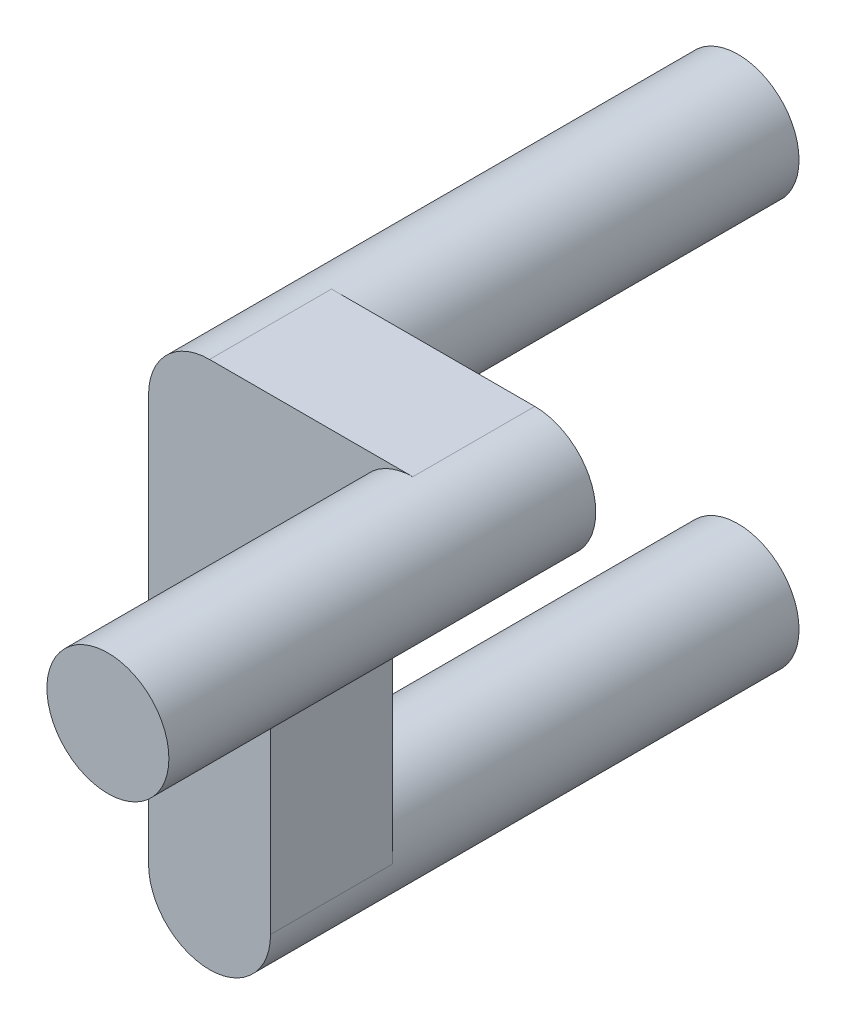
ISO-10303-21;
HEADER;
FILE_DESCRIPTION(('STEP AP214'),'2;1');
FILE_NAME('part.step','',(''),(''),'','','');
FILE_SCHEMA(('AUTOMOTIVE_DESIGN { 1 0 10303 214 1 1 1 1 }'));
ENDSEC;
DATA;
#1=APPLICATION_CONTEXT('core data for automotive mechanical design processes');
#2=APPLICATION_PROTOCOL_DEFINITION('international standard','automotive_design',2000,#1);
#3=PRODUCT_CONTEXT('',#1,'mechanical');
#4=PRODUCT('Part','Part','',(#3));
#5=PRODUCT_RELATED_PRODUCT_CATEGORY('part','',(#4));
#6=PRODUCT_DEFINITION_FORMATION('','',#4);
#7=PRODUCT_DEFINITION_CONTEXT('part definition',#1,'design');
#8=PRODUCT_DEFINITION('design','',#6,#7);
#9=PRODUCT_DEFINITION_SHAPE('','',#8);
#10=(LENGTH_UNIT() NAMED_UNIT(*) SI_UNIT(.MILLI.,.METRE.));
#11=(NAMED_UNIT(*) PLANE_ANGLE_UNIT() SI_UNIT($,.RADIAN.));
#12=(NAMED_UNIT(*) SI_UNIT($,.STERADIAN.) SOLID_ANGLE_UNIT());
#13=UNCERTAINTY_MEASURE_WITH_UNIT(LENGTH_MEASURE(1.E-05),#10,'distance_accuracy_value','');
#14=(GEOMETRIC_REPRESENTATION_CONTEXT(3) GLOBAL_UNCERTAINTY_ASSIGNED_CONTEXT((#13)) GLOBAL_UNIT_ASSIGNED_CONTEXT((#10,
#11,#12)) REPRESENTATION_CONTEXT('',''));
#15=CARTESIAN_POINT('',(0.,0.,0.));
#16=DIRECTION('',(0.,0.,1.));
#17=DIRECTION('',(1.,0.,0.));
#18=AXIS2_PLACEMENT_3D('',#15,#16,#17);
#19=CARTESIAN_POINT('',(7.62,7.62,66.04));
#20=DIRECTION('',(0.,0.,1.));
#21=DIRECTION('',(1.,0.,0.));
#22=AXIS2_PLACEMENT_3D('',#19,#20,#21);
#23=PLANE('',#22);
#24=CARTESIAN_POINT('',(0.,-50.8,66.04));
#25=DIRECTION('',(0.,0.,1.));
#26=DIRECTION('',(1.,0.,0.));
#27=AXIS2_PLACEMENT_3D('',#24,#25,#26);
#28=CIRCLE('',#27,7.62);
#29=CARTESIAN_POINT('',(-7.62,-50.8,66.04));
#30=VERTEX_POINT('',#29);
#31=CARTESIAN_POINT('',(7.62,-50.8,66.04));
#32=VERTEX_POINT('',#31);
#33=EDGE_CURVE('E119',#30,#32,#28,.T.);
#34=ORIENTED_EDGE('',*,*,#33,.T.);
#35=DIRECTION('',(0.,-1.,0.));
#36=VECTOR('',#35,1.);
#37=CARTESIAN_POINT('',(7.62,7.62,66.04));
#38=LINE('',#37,#36);
#39=CARTESIAN_POINT('',(7.62,-7.62,66.04));
#40=VERTEX_POINT('',#39);
#41=EDGE_CURVE('E122',#40,#32,#38,.T.);
#42=ORIENTED_EDGE('',*,*,#41,.F.);
#43=DIRECTION('',(1.,0.,0.));
#44=VECTOR('',#43,1.);
#45=CARTESIAN_POINT('',(-7.62,-7.62,66.04));
#46=LINE('',#45,#44);
#47=CARTESIAN_POINT('',(25.4,-7.62,66.04));
#48=VERTEX_POINT('',#47);
#49=EDGE_CURVE('E83',#40,#48,#46,.T.);
#50=ORIENTED_EDGE('',*,*,#49,.T.);
#51=CARTESIAN_POINT('',(25.4,0.,66.04));
#52=DIRECTION('',(0.,0.,1.));
#53=DIRECTION('',(1.,0.,0.));
#54=AXIS2_PLACEMENT_3D('',#51,#52,#53);
#55=CIRCLE('',#54,7.62);
#56=CARTESIAN_POINT('',(25.4,7.62,66.04));
#57=VERTEX_POINT('',#56);
#58=EDGE_CURVE('E161',#57,#48,#55,.T.);
#59=ORIENTED_EDGE('',*,*,#58,.F.);
#60=DIRECTION('',(-1.,0.,0.));
#61=VECTOR('',#60,1.);
#62=CARTESIAN_POINT('',(7.62,7.62,66.04));
#63=LINE('',#62,#61);
#64=CARTESIAN_POINT('',(0.,7.62,66.04));
#65=VERTEX_POINT('',#64);
#66=EDGE_CURVE('E147',#57,#65,#63,.T.);
#67=ORIENTED_EDGE('',*,*,#66,.T.);
#68=CARTESIAN_POINT('',(0.,0.,66.04));
#69=DIRECTION('',(0.,0.,1.));
#70=DIRECTION('',(1.,0.,0.));
#71=AXIS2_PLACEMENT_3D('',#68,#69,#70);
#72=CIRCLE('',#71,7.62);
#73=CARTESIAN_POINT('',(-7.62,0.,66.04));
#74=VERTEX_POINT('',#73);
#75=EDGE_CURVE('E75',#65,#74,#72,.T.);
#76=ORIENTED_EDGE('',*,*,#75,.T.);
#77=DIRECTION('',(0.,-1.,0.));
#78=VECTOR('',#77,1.);
#79=CARTESIAN_POINT('',(-7.62,7.62,66.04));
#80=LINE('',#79,#78);
#81=EDGE_CURVE('E124',#74,#30,#80,.T.);
#82=ORIENTED_EDGE('',*,*,#81,.T.);
#83=EDGE_LOOP('',(#34,#42,#50,#59,#67,#76,#82));
#84=FACE_BOUND('',#83,.T.);
#85=ADVANCED_FACE('F59',(#84),#23,.T.);
#86=CARTESIAN_POINT('',(7.62,7.62,50.8));
#87=DIRECTION('',(1.,0.,0.));
#88=DIRECTION('',(0.,0.,-1.));
#89=AXIS2_PLACEMENT_3D('',#86,#87,#88);
#90=PLANE('',#89);
#91=ORIENTED_EDGE('',*,*,#41,.T.);
#92=DIRECTION('',(0.,0.,-1.));
#93=VECTOR('',#92,1.);
#94=CARTESIAN_POINT('',(7.62,-50.8,92.456));
#95=LINE('',#94,#93);
#96=CARTESIAN_POINT('',(7.62,-50.8,50.8));
#97=VERTEX_POINT('',#96);
#98=EDGE_CURVE('E131',#32,#97,#95,.T.);
#99=ORIENTED_EDGE('',*,*,#98,.T.);
#100=DIRECTION('',(0.,-1.,0.));
#101=VECTOR('',#100,1.);
#102=CARTESIAN_POINT('',(7.62,7.62,50.8));
#103=LINE('',#102,#101);
#104=CARTESIAN_POINT('',(7.62,-7.62,50.8));
#105=VERTEX_POINT('',#104);
#106=EDGE_CURVE('E153',#105,#97,#103,.T.);
#107=ORIENTED_EDGE('',*,*,#106,.F.);
#108=DIRECTION('',(0.,0.,1.));
#109=VECTOR('',#108,1.);
#110=CARTESIAN_POINT('',(7.62,-7.62,50.8));
#111=LINE('',#110,#109);
#112=EDGE_CURVE('E139',#105,#40,#111,.T.);
#113=ORIENTED_EDGE('',*,*,#112,.T.);
#114=EDGE_LOOP('',(#91,#99,#107,#113));
#115=FACE_BOUND('',#114,.T.);
#116=ADVANCED_FACE('F138',(#115),#90,.T.);
#117=CARTESIAN_POINT('',(-7.62,7.62,50.8));
#118=DIRECTION('',(-1.,0.,0.));
#119=DIRECTION('',(0.,0.,1.));
#120=AXIS2_PLACEMENT_3D('',#117,#118,#119);
#121=PLANE('',#120);
#122=ORIENTED_EDGE('',*,*,#81,.F.);
#123=DIRECTION('',(0.,0.,-1.));
#124=VECTOR('',#123,1.);
#125=CARTESIAN_POINT('',(-7.62,0.,92.456));
#126=LINE('',#125,#124);
#127=CARTESIAN_POINT('',(-7.62,0.,50.8));
#128=VERTEX_POINT('',#127);
#129=EDGE_CURVE('E197',#74,#128,#126,.T.);
#130=ORIENTED_EDGE('',*,*,#129,.T.);
#131=DIRECTION('',(0.,-1.,0.));
#132=VECTOR('',#131,1.);
#133=CARTESIAN_POINT('',(-7.62,7.62,50.8));
#134=LINE('',#133,#132);
#135=CARTESIAN_POINT('',(-7.62,-50.8,50.8));
#136=VERTEX_POINT('',#135);
#137=EDGE_CURVE('E145',#128,#136,#134,.T.);
#138=ORIENTED_EDGE('',*,*,#137,.T.);
#139=DIRECTION('',(0.,0.,-1.));
#140=VECTOR('',#139,1.);
#141=CARTESIAN_POINT('',(-7.62,-50.8,92.456));
#142=LINE('',#141,#140);
#143=EDGE_CURVE('E136',#30,#136,#142,.T.);
#144=ORIENTED_EDGE('',*,*,#143,.F.);
#145=EDGE_LOOP('',(#122,#130,#138,#144));
#146=FACE_BOUND('',#145,.T.);
#147=ADVANCED_FACE('F235',(#146),#121,.T.);
#148=CARTESIAN_POINT('',(0.,7.62,0.));
#149=DIRECTION('',(0.,-1.,0.));
#150=DIRECTION('',(0.,0.,-1.));
#151=AXIS2_PLACEMENT_3D('',#148,#149,#150);
#152=PLANE('',#151);
#153=DIRECTION('',(0.,0.,-1.));
#154=VECTOR('',#153,1.);
#155=CARTESIAN_POINT('',(0.,7.62,92.456));
#156=LINE('',#155,#154);
#157=CARTESIAN_POINT('',(0.,7.62,50.8));
#158=VERTEX_POINT('',#157);
#159=EDGE_CURVE('E194',#65,#158,#156,.T.);
#160=ORIENTED_EDGE('',*,*,#159,.F.);
#161=ORIENTED_EDGE('',*,*,#66,.F.);
#162=DIRECTION('',(0.,0.,1.));
#163=VECTOR('',#162,1.);
#164=CARTESIAN_POINT('',(25.4,7.62,18.034));
#165=LINE('',#164,#163);
#166=CARTESIAN_POINT('',(25.4,7.62,50.8));
#167=VERTEX_POINT('',#166);
#168=EDGE_CURVE('E186',#167,#57,#165,.T.);
#169=ORIENTED_EDGE('',*,*,#168,.F.);
#170=DIRECTION('',(1.,0.,0.));
#171=VECTOR('',#170,1.);
#172=CARTESIAN_POINT('',(7.62,7.62,50.8));
#173=LINE('',#172,#171);
#174=EDGE_CURVE('E141',#158,#167,#173,.T.);
#175=ORIENTED_EDGE('',*,*,#174,.F.);
#176=EDGE_LOOP('',(#160,#161,#169,#175));
#177=FACE_BOUND('',#176,.T.);
#178=ADVANCED_FACE('F210',(#177),#152,.F.);
#179=CARTESIAN_POINT('',(7.62,7.62,50.8));
#180=DIRECTION('',(0.,0.,-1.));
#181=DIRECTION('',(-1.,0.,0.));
#182=AXIS2_PLACEMENT_3D('',#179,#180,#181);
#183=PLANE('',#182);
#184=ORIENTED_EDGE('',*,*,#137,.F.);
#185=CARTESIAN_POINT('',(0.,0.,50.8));
#186=DIRECTION('',(0.,0.,1.));
#187=DIRECTION('',(1.,0.,0.));
#188=AXIS2_PLACEMENT_3D('',#185,#186,#187);
#189=CIRCLE('',#188,7.62);
#190=EDGE_CURVE('E166',#128,#158,#189,.T.);
#191=ORIENTED_EDGE('',*,*,#190,.T.);
#192=ORIENTED_EDGE('',*,*,#174,.T.);
#193=CARTESIAN_POINT('',(25.4,0.,50.8));
#194=DIRECTION('',(0.,0.,-1.));
#195=DIRECTION('',(-1.,0.,0.));
#196=AXIS2_PLACEMENT_3D('',#193,#194,#195);
#197=CIRCLE('',#196,7.62);
#198=CARTESIAN_POINT('',(25.4,-7.62,50.8));
#199=VERTEX_POINT('',#198);
#200=EDGE_CURVE('E182',#167,#199,#197,.T.);
#201=ORIENTED_EDGE('',*,*,#200,.T.);
#202=DIRECTION('',(1.,0.,0.));
#203=VECTOR('',#202,1.);
#204=CARTESIAN_POINT('',(-7.62,-7.62,50.8));
#205=LINE('',#204,#203);
#206=EDGE_CURVE('E170',#105,#199,#205,.T.);
#207=ORIENTED_EDGE('',*,*,#206,.F.);
#208=ORIENTED_EDGE('',*,*,#106,.T.);
#209=CARTESIAN_POINT('',(0.,-50.8,50.8));
#210=DIRECTION('',(0.,0.,1.));
#211=DIRECTION('',(1.,0.,0.));
#212=AXIS2_PLACEMENT_3D('',#209,#210,#211);
#213=CIRCLE('',#212,7.62);
#214=EDGE_CURVE('E12',#97,#136,#213,.T.);
#215=ORIENTED_EDGE('',*,*,#214,.T.);
#216=EDGE_LOOP('',(#184,#191,#192,#201,#207,#208,#215));
#217=FACE_BOUND('',#216,.T.);
#218=ADVANCED_FACE('F207',(#217),#183,.T.);
#219=CARTESIAN_POINT('',(0.,-50.8,50.8));
#220=DIRECTION('',(0.,0.,-1.));
#221=DIRECTION('',(-1.,0.,0.));
#222=AXIS2_PLACEMENT_3D('',#219,#220,#221);
#223=CYLINDRICAL_SURFACE('',#222,7.62);
#224=CARTESIAN_POINT('',(0.,-50.8,0.));
#225=DIRECTION('',(0.,0.,1.));
#226=DIRECTION('',(1.,0.,0.));
#227=AXIS2_PLACEMENT_3D('',#224,#225,#226);
#228=CIRCLE('',#227,7.62);
#229=CARTESIAN_POINT('',(7.62000000000001,-50.8,0.));
#230=VERTEX_POINT('',#229);
#231=EDGE_CURVE('E63',#230,#230,#228,.T.);
#232=ORIENTED_EDGE('',*,*,#231,.T.);
#233=EDGE_LOOP('',(#232));
#234=FACE_BOUND('',#233,.T.);
#235=ORIENTED_EDGE('',*,*,#214,.F.);
#236=ORIENTED_EDGE('',*,*,#98,.F.);
#237=ORIENTED_EDGE('',*,*,#33,.F.);
#238=ORIENTED_EDGE('',*,*,#143,.T.);
#239=EDGE_LOOP('',(#235,#236,#237,#238));
#240=FACE_BOUND('',#239,.T.);
#241=ADVANCED_FACE('F61',(#234,#240),#223,.T.);
#242=CARTESIAN_POINT('',(0.,0.,0.));
#243=DIRECTION('',(0.,0.,1.));
#244=DIRECTION('',(1.,0.,0.));
#245=AXIS2_PLACEMENT_3D('',#242,#243,#244);
#246=PLANE('',#245);
#247=ORIENTED_EDGE('',*,*,#231,.F.);
#248=EDGE_LOOP('',(#247));
#249=FACE_BOUND('',#248,.T.);
#250=ADVANCED_FACE('F239',(#249),#246,.F.);
#251=CARTESIAN_POINT('',(0.,0.,104.14));
#252=DIRECTION('',(0.,0.,1.));
#253=DIRECTION('',(1.,0.,0.));
#254=AXIS2_PLACEMENT_3D('',#251,#252,#253);
#255=PLANE('',#254);
#256=CARTESIAN_POINT('',(25.4,0.,104.14));
#257=DIRECTION('',(0.,0.,1.));
#258=DIRECTION('',(1.,0.,0.));
#259=AXIS2_PLACEMENT_3D('',#256,#257,#258);
#260=CIRCLE('',#259,7.62);
#261=CARTESIAN_POINT('',(33.02,0.,104.14));
#262=VERTEX_POINT('',#261);
#263=EDGE_CURVE('E173',#262,#262,#260,.T.);
#264=ORIENTED_EDGE('',*,*,#263,.T.);
#265=EDGE_LOOP('',(#264));
#266=FACE_BOUND('',#265,.T.);
#267=ADVANCED_FACE('F227',(#266),#255,.T.);
#268=CARTESIAN_POINT('',(25.4,0.,104.14));
#269=DIRECTION('',(0.,0.,-1.));
#270=DIRECTION('',(-1.,0.,0.));
#271=AXIS2_PLACEMENT_3D('',#268,#269,#270);
#272=CYLINDRICAL_SURFACE('',#271,7.62);
#273=ORIENTED_EDGE('',*,*,#58,.T.);
#274=DIRECTION('',(0.,0.,1.));
#275=VECTOR('',#274,1.);
#276=CARTESIAN_POINT('',(25.4,-7.62,18.034));
#277=LINE('',#276,#275);
#278=EDGE_CURVE('E128',#199,#48,#277,.T.);
#279=ORIENTED_EDGE('',*,*,#278,.F.);
#280=ORIENTED_EDGE('',*,*,#200,.F.);
#281=ORIENTED_EDGE('',*,*,#168,.T.);
#282=EDGE_LOOP('',(#273,#279,#280,#281));
#283=FACE_BOUND('',#282,.T.);
#284=ORIENTED_EDGE('',*,*,#263,.F.);
#285=EDGE_LOOP('',(#284));
#286=FACE_BOUND('',#285,.T.);
#287=ADVANCED_FACE('F213',(#283,#286),#272,.T.);
#288=CARTESIAN_POINT('',(-7.62,-7.62,66.04));
#289=DIRECTION('',(0.,1.,0.));
#290=DIRECTION('',(0.,0.,1.));
#291=AXIS2_PLACEMENT_3D('',#288,#289,#290);
#292=PLANE('',#291);
#293=ORIENTED_EDGE('',*,*,#112,.F.);
#294=ORIENTED_EDGE('',*,*,#206,.T.);
#295=ORIENTED_EDGE('',*,*,#278,.T.);
#296=ORIENTED_EDGE('',*,*,#49,.F.);
#297=EDGE_LOOP('',(#293,#294,#295,#296));
#298=FACE_BOUND('',#297,.T.);
#299=ADVANCED_FACE('F216',(#298),#292,.F.);
#300=CARTESIAN_POINT('',(0.,0.,50.8));
#301=DIRECTION('',(0.,0.,-1.));
#302=DIRECTION('',(-1.,0.,0.));
#303=AXIS2_PLACEMENT_3D('',#300,#301,#302);
#304=CYLINDRICAL_SURFACE('',#303,7.62);
#305=CARTESIAN_POINT('',(0.,0.,0.));
#306=DIRECTION('',(0.,0.,1.));
#307=DIRECTION('',(1.,0.,0.));
#308=AXIS2_PLACEMENT_3D('',#305,#306,#307);
#309=CIRCLE('',#308,7.62);
#310=CARTESIAN_POINT('',(7.62,0.,0.));
#311=VERTEX_POINT('',#310);
#312=EDGE_CURVE('E162',#311,#311,#309,.T.);
#313=ORIENTED_EDGE('',*,*,#312,.T.);
#314=EDGE_LOOP('',(#313));
#315=FACE_BOUND('',#314,.T.);
#316=ORIENTED_EDGE('',*,*,#190,.F.);
#317=ORIENTED_EDGE('',*,*,#129,.F.);
#318=ORIENTED_EDGE('',*,*,#75,.F.);
#319=ORIENTED_EDGE('',*,*,#159,.T.);
#320=EDGE_LOOP('',(#316,#317,#318,#319));
#321=FACE_BOUND('',#320,.T.);
#322=ADVANCED_FACE('F202',(#315,#321),#304,.T.);
#323=CARTESIAN_POINT('',(0.,0.,0.));
#324=DIRECTION('',(0.,0.,1.));
#325=DIRECTION('',(1.,0.,0.));
#326=AXIS2_PLACEMENT_3D('',#323,#324,#325);
#327=PLANE('',#326);
#328=ORIENTED_EDGE('',*,*,#312,.F.);
#329=EDGE_LOOP('',(#328));
#330=FACE_BOUND('',#329,.T.);
#331=ADVANCED_FACE('F224',(#330),#327,.F.);
#332=CLOSED_SHELL('',(#85,#116,#147,#178,#218,#241,#250,#267,#287,#299,#322,#331));
#333=MANIFOLD_SOLID_BREP('B2',#332);
#334=ADVANCED_BREP_SHAPE_REPRESENTATION('',(#18,#333),#14);
#335=SHAPE_DEFINITION_REPRESENTATION(#9,#334);
ENDSEC;
END-ISO-10303-21;
